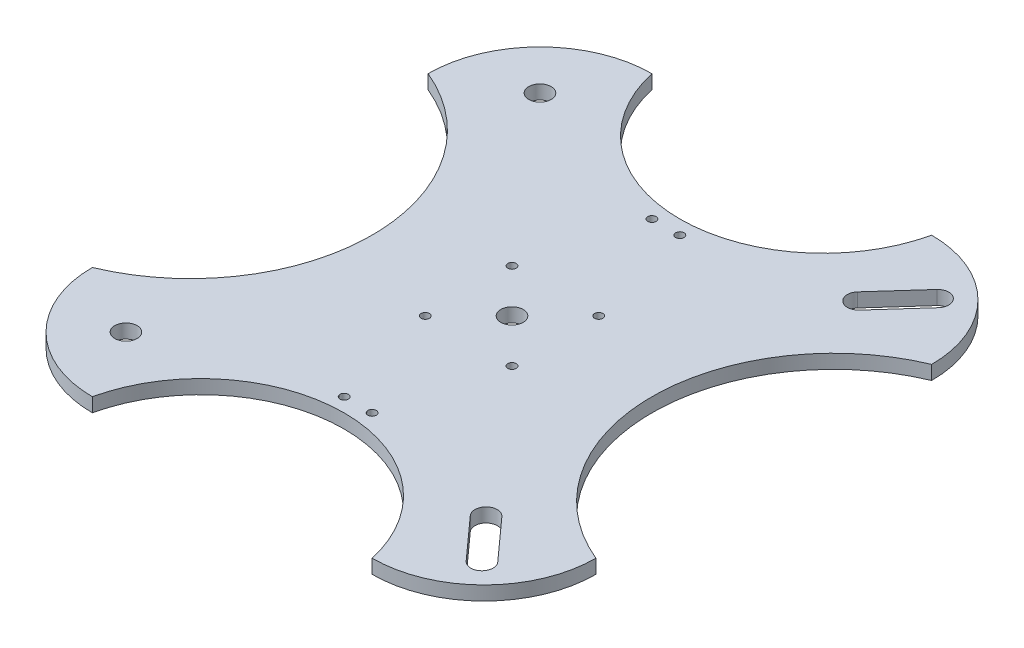
ISO-10303-21;
HEADER;
FILE_DESCRIPTION(('STEP AP214'),'2;1');
FILE_NAME('part.step','',(''),(''),'','','');
FILE_SCHEMA(('AUTOMOTIVE_DESIGN { 1 0 10303 214 1 1 1 1 }'));
ENDSEC;
DATA;
#1=APPLICATION_CONTEXT('core data for automotive mechanical design processes');
#2=APPLICATION_PROTOCOL_DEFINITION('international standard','automotive_design',2000,#1);
#3=PRODUCT_CONTEXT('',#1,'mechanical');
#4=PRODUCT('Part','Part','',(#3));
#5=PRODUCT_RELATED_PRODUCT_CATEGORY('part','',(#4));
#6=PRODUCT_DEFINITION_FORMATION('','',#4);
#7=PRODUCT_DEFINITION_CONTEXT('part definition',#1,'design');
#8=PRODUCT_DEFINITION('design','',#6,#7);
#9=PRODUCT_DEFINITION_SHAPE('','',#8);
#10=(LENGTH_UNIT() NAMED_UNIT(*) SI_UNIT(.MILLI.,.METRE.));
#11=(NAMED_UNIT(*) PLANE_ANGLE_UNIT() SI_UNIT($,.RADIAN.));
#12=(NAMED_UNIT(*) SI_UNIT($,.STERADIAN.) SOLID_ANGLE_UNIT());
#13=UNCERTAINTY_MEASURE_WITH_UNIT(LENGTH_MEASURE(1.E-05),#10,'distance_accuracy_value','');
#14=(GEOMETRIC_REPRESENTATION_CONTEXT(3) GLOBAL_UNCERTAINTY_ASSIGNED_CONTEXT((#13)) GLOBAL_UNIT_ASSIGNED_CONTEXT((#10,
#11,#12)) REPRESENTATION_CONTEXT('',''));
#15=CARTESIAN_POINT('',(0.,0.,0.));
#16=DIRECTION('',(0.,0.,1.));
#17=DIRECTION('',(1.,0.,0.));
#18=AXIS2_PLACEMENT_3D('',#15,#16,#17);
#19=CARTESIAN_POINT('',(-25.,5.,-85.625));
#20=DIRECTION('',(0.,-1.,0.));
#21=DIRECTION('',(0.,0.,-1.));
#22=AXIS2_PLACEMENT_3D('',#19,#20,#21);
#23=PLANE('',#22);
#24=CARTESIAN_POINT('',(5.,5.,55.));
#25=DIRECTION('',(0.,1.,0.));
#26=DIRECTION('',(0.,0.,1.));
#27=AXIS2_PLACEMENT_3D('',#24,#25,#26);
#28=CIRCLE('',#27,1.5);
#29=CARTESIAN_POINT('',(5.,5.,56.5));
#30=VERTEX_POINT('',#29);
#31=EDGE_CURVE('E526',#30,#30,#28,.T.);
#32=ORIENTED_EDGE('',*,*,#31,.F.);
#33=EDGE_LOOP('',(#32));
#34=FACE_BOUND('',#33,.T.);
#35=CARTESIAN_POINT('',(-5.,5.,55.));
#36=DIRECTION('',(0.,1.,0.));
#37=DIRECTION('',(0.,0.,1.));
#38=AXIS2_PLACEMENT_3D('',#35,#36,#37);
#39=CIRCLE('',#38,1.5);
#40=CARTESIAN_POINT('',(-5.,5.,56.5));
#41=VERTEX_POINT('',#40);
#42=EDGE_CURVE('E528',#41,#41,#39,.T.);
#43=ORIENTED_EDGE('',*,*,#42,.F.);
#44=EDGE_LOOP('',(#43));
#45=FACE_BOUND('',#44,.T.);
#46=CARTESIAN_POINT('',(5.,5.,-55.));
#47=DIRECTION('',(0.,1.,0.));
#48=DIRECTION('',(0.,0.,1.));
#49=AXIS2_PLACEMENT_3D('',#46,#47,#48);
#50=CIRCLE('',#49,1.5);
#51=CARTESIAN_POINT('',(5.,5.,-53.5));
#52=VERTEX_POINT('',#51);
#53=EDGE_CURVE('E534',#52,#52,#50,.T.);
#54=ORIENTED_EDGE('',*,*,#53,.F.);
#55=EDGE_LOOP('',(#54));
#56=FACE_BOUND('',#55,.T.);
#57=CARTESIAN_POINT('',(-5.,5.,-55.));
#58=DIRECTION('',(0.,1.,0.));
#59=DIRECTION('',(0.,0.,1.));
#60=AXIS2_PLACEMENT_3D('',#57,#58,#59);
#61=CIRCLE('',#60,1.5);
#62=CARTESIAN_POINT('',(-5.,5.,-53.5));
#63=VERTEX_POINT('',#62);
#64=EDGE_CURVE('E540',#63,#63,#61,.T.);
#65=ORIENTED_EDGE('',*,*,#64,.F.);
#66=EDGE_LOOP('',(#65));
#67=FACE_BOUND('',#66,.T.);
#68=CARTESIAN_POINT('',(-15.5,5.,15.5));
#69=DIRECTION('',(0.,1.,0.));
#70=DIRECTION('',(0.,0.,1.));
#71=AXIS2_PLACEMENT_3D('',#68,#69,#70);
#72=CIRCLE('',#71,1.5);
#73=CARTESIAN_POINT('',(-15.5,5.,17.));
#74=VERTEX_POINT('',#73);
#75=EDGE_CURVE('E546',#74,#74,#72,.T.);
#76=ORIENTED_EDGE('',*,*,#75,.F.);
#77=EDGE_LOOP('',(#76));
#78=FACE_BOUND('',#77,.T.);
#79=CARTESIAN_POINT('',(15.5,5.,15.5));
#80=DIRECTION('',(0.,1.,0.));
#81=DIRECTION('',(0.,0.,1.));
#82=AXIS2_PLACEMENT_3D('',#79,#80,#81);
#83=CIRCLE('',#82,1.5);
#84=CARTESIAN_POINT('',(15.5,5.,17.));
#85=VERTEX_POINT('',#84);
#86=EDGE_CURVE('E552',#85,#85,#83,.T.);
#87=ORIENTED_EDGE('',*,*,#86,.F.);
#88=EDGE_LOOP('',(#87));
#89=FACE_BOUND('',#88,.T.);
#90=CARTESIAN_POINT('',(15.5,5.,-15.5));
#91=DIRECTION('',(0.,1.,0.));
#92=DIRECTION('',(0.,0.,1.));
#93=AXIS2_PLACEMENT_3D('',#90,#91,#92);
#94=CIRCLE('',#93,1.5);
#95=CARTESIAN_POINT('',(15.5,5.,-14.));
#96=VERTEX_POINT('',#95);
#97=EDGE_CURVE('E558',#96,#96,#94,.T.);
#98=ORIENTED_EDGE('',*,*,#97,.F.);
#99=EDGE_LOOP('',(#98));
#100=FACE_BOUND('',#99,.T.);
#101=CARTESIAN_POINT('',(-15.5,5.,-15.5));
#102=DIRECTION('',(0.,1.,0.));
#103=DIRECTION('',(0.,0.,1.));
#104=AXIS2_PLACEMENT_3D('',#101,#102,#103);
#105=CIRCLE('',#104,1.5);
#106=CARTESIAN_POINT('',(-15.5,5.,-14.));
#107=VERTEX_POINT('',#106);
#108=EDGE_CURVE('E564',#107,#107,#105,.T.);
#109=ORIENTED_EDGE('',*,*,#108,.F.);
#110=EDGE_LOOP('',(#109));
#111=FACE_BOUND('',#110,.T.);
#112=CARTESIAN_POINT('',(70.6896473162245,5.,81.4329414624716));
#113=DIRECTION('',(0.,1.,0.));
#114=DIRECTION('',(0.,0.,-1.));
#115=AXIS2_PLACEMENT_3D('',#112,#113,#114);
#116=CIRCLE('',#115,3.99999999999999);
#117=CARTESIAN_POINT('',(67.7164707312358,5.,84.1088003889613));
#118=VERTEX_POINT('',#117);
#119=CARTESIAN_POINT('',(73.6628239012131,5.,78.7570825359817));
#120=VERTEX_POINT('',#119);
#121=EDGE_CURVE('E184',#118,#120,#116,.T.);
#122=ORIENTED_EDGE('',*,*,#121,.F.);
#123=DIRECTION('',(0.668964731622449,0.,0.743294146247166));
#124=VECTOR('',#123,1.);
#125=CARTESIAN_POINT('',(67.7164707312358,5.,84.1088003889613));
#126=LINE('',#125,#124);
#127=CARTESIAN_POINT('',(54.3371760987868,5.,69.242917464018));
#128=VERTEX_POINT('',#127);
#129=EDGE_CURVE('E192',#128,#118,#126,.T.);
#130=ORIENTED_EDGE('',*,*,#129,.F.);
#131=CARTESIAN_POINT('',(57.3103526837755,5.,66.5670585375282));
#132=DIRECTION('',(0.,1.,0.));
#133=DIRECTION('',(0.,0.,1.));
#134=AXIS2_PLACEMENT_3D('',#131,#132,#133);
#135=CIRCLE('',#134,3.99999999999998);
#136=CARTESIAN_POINT('',(60.2835292687642,5.,63.8911996110384));
#137=VERTEX_POINT('',#136);
#138=EDGE_CURVE('E189',#137,#128,#135,.T.);
#139=ORIENTED_EDGE('',*,*,#138,.F.);
#140=DIRECTION('',(-0.66896473162245,0.,-0.743294146247166));
#141=VECTOR('',#140,1.);
#142=CARTESIAN_POINT('',(73.6628239012131,5.,78.7570825359817));
#143=LINE('',#142,#141);
#144=EDGE_CURVE('E186',#120,#137,#143,.T.);
#145=ORIENTED_EDGE('',*,*,#144,.F.);
#146=EDGE_LOOP('',(#122,#130,#139,#145));
#147=FACE_BOUND('',#146,.T.);
#148=CARTESIAN_POINT('',(-63.9999999999999,5.,73.9999999999999));
#149=DIRECTION('',(0.,1.,0.));
#150=DIRECTION('',(0.,0.,1.));
#151=AXIS2_PLACEMENT_3D('',#148,#149,#150);
#152=CIRCLE('',#151,4.00000000000001);
#153=CARTESIAN_POINT('',(-63.9999999999999,5.,77.9999999999999));
#154=VERTEX_POINT('',#153);
#155=EDGE_CURVE('E221',#154,#154,#152,.T.);
#156=ORIENTED_EDGE('',*,*,#155,.F.);
#157=EDGE_LOOP('',(#156));
#158=FACE_BOUND('',#157,.T.);
#159=CARTESIAN_POINT('',(0.,5.,-111.25));
#160=DIRECTION('',(0.,-1.,0.));
#161=DIRECTION('',(0.,0.,-1.));
#162=AXIS2_PLACEMENT_3D('',#159,#160,#161);
#163=CIRCLE('',#162,51.25);
#164=CARTESIAN_POINT('',(50.,5.,-100.));
#165=VERTEX_POINT('',#164);
#166=CARTESIAN_POINT('',(-50.,5.,-100.));
#167=VERTEX_POINT('',#166);
#168=EDGE_CURVE('E233',#165,#167,#163,.T.);
#169=ORIENTED_EDGE('',*,*,#168,.T.);
#170=CARTESIAN_POINT('',(-50.,5.,-59.9999999999999));
#171=DIRECTION('',(0.,1.,0.));
#172=DIRECTION('',(0.,0.,1.));
#173=AXIS2_PLACEMENT_3D('',#170,#171,#172);
#174=CIRCLE('',#173,40.0000000000001);
#175=CARTESIAN_POINT('',(-90.,5.,-60.));
#176=VERTEX_POINT('',#175);
#177=EDGE_CURVE('E236',#167,#176,#174,.T.);
#178=ORIENTED_EDGE('',*,*,#177,.T.);
#179=CARTESIAN_POINT('',(-115.,5.,0.));
#180=DIRECTION('',(0.,-1.,0.));
#181=DIRECTION('',(0.,0.,-1.));
#182=AXIS2_PLACEMENT_3D('',#179,#180,#181);
#183=CIRCLE('',#182,64.9999999999998);
#184=CARTESIAN_POINT('',(-90.,5.,59.9999999999999));
#185=VERTEX_POINT('',#184);
#186=EDGE_CURVE('E239',#176,#185,#183,.T.);
#187=ORIENTED_EDGE('',*,*,#186,.T.);
#188=CARTESIAN_POINT('',(-49.9999999999999,5.,59.9999999999999));
#189=DIRECTION('',(0.,1.,0.));
#190=DIRECTION('',(0.,0.,-1.));
#191=AXIS2_PLACEMENT_3D('',#188,#189,#190);
#192=CIRCLE('',#191,40.0000000000001);
#193=CARTESIAN_POINT('',(-49.9999999999999,5.,100.));
#194=VERTEX_POINT('',#193);
#195=EDGE_CURVE('E241',#185,#194,#192,.T.);
#196=ORIENTED_EDGE('',*,*,#195,.T.);
#197=CARTESIAN_POINT('',(0.,5.,111.25));
#198=DIRECTION('',(0.,-1.,0.));
#199=DIRECTION('',(0.,0.,1.));
#200=AXIS2_PLACEMENT_3D('',#197,#198,#199);
#201=CIRCLE('',#200,51.2499999999999);
#202=CARTESIAN_POINT('',(49.9999999999999,5.,100.));
#203=VERTEX_POINT('',#202);
#204=EDGE_CURVE('E243',#194,#203,#201,.T.);
#205=ORIENTED_EDGE('',*,*,#204,.T.);
#206=CARTESIAN_POINT('',(49.9999999999999,5.,59.9999999999999));
#207=DIRECTION('',(0.,1.,0.));
#208=DIRECTION('',(0.,0.,-1.));
#209=AXIS2_PLACEMENT_3D('',#206,#207,#208);
#210=CIRCLE('',#209,40.0000000000001);
#211=CARTESIAN_POINT('',(90.,5.,60.));
#212=VERTEX_POINT('',#211);
#213=EDGE_CURVE('E245',#203,#212,#210,.T.);
#214=ORIENTED_EDGE('',*,*,#213,.T.);
#215=CARTESIAN_POINT('',(115.,5.,0.));
#216=DIRECTION('',(0.,-1.,0.));
#217=DIRECTION('',(0.,0.,1.));
#218=AXIS2_PLACEMENT_3D('',#215,#216,#217);
#219=CIRCLE('',#218,65.);
#220=CARTESIAN_POINT('',(90.,5.,-60.));
#221=VERTEX_POINT('',#220);
#222=EDGE_CURVE('E247',#212,#221,#219,.T.);
#223=ORIENTED_EDGE('',*,*,#222,.T.);
#224=CARTESIAN_POINT('',(50.,5.,-60.));
#225=DIRECTION('',(0.,1.,0.));
#226=DIRECTION('',(0.,0.,-1.));
#227=AXIS2_PLACEMENT_3D('',#224,#225,#226);
#228=CIRCLE('',#227,40.);
#229=EDGE_CURVE('E249',#221,#165,#228,.T.);
#230=ORIENTED_EDGE('',*,*,#229,.T.);
#231=EDGE_LOOP('',(#169,#178,#187,#196,#205,#214,#223,#230));
#232=FACE_BOUND('',#231,.T.);
#233=CARTESIAN_POINT('',(-63.9999999999999,5.,-74.));
#234=DIRECTION('',(0.,1.,0.));
#235=DIRECTION('',(0.,0.,1.));
#236=AXIS2_PLACEMENT_3D('',#233,#234,#235);
#237=CIRCLE('',#236,4.00000000000001);
#238=CARTESIAN_POINT('',(-63.9999999999999,5.,-70.));
#239=VERTEX_POINT('',#238);
#240=EDGE_CURVE('E227',#239,#239,#237,.T.);
#241=ORIENTED_EDGE('',*,*,#240,.F.);
#242=EDGE_LOOP('',(#241));
#243=FACE_BOUND('',#242,.T.);
#244=CARTESIAN_POINT('',(0.,5.,0.));
#245=DIRECTION('',(0.,1.,0.));
#246=DIRECTION('',(0.,0.,1.));
#247=AXIS2_PLACEMENT_3D('',#244,#245,#246);
#248=CIRCLE('',#247,4.00000000000001);
#249=CARTESIAN_POINT('',(0.,5.,4.00000000000001));
#250=VERTEX_POINT('',#249);
#251=EDGE_CURVE('E215',#250,#250,#248,.T.);
#252=ORIENTED_EDGE('',*,*,#251,.F.);
#253=EDGE_LOOP('',(#252));
#254=FACE_BOUND('',#253,.T.);
#255=CARTESIAN_POINT('',(57.3103526837754,5.,-66.5670585375283));
#256=DIRECTION('',(0.,1.,0.));
#257=DIRECTION('',(0.,0.,-1.));
#258=AXIS2_PLACEMENT_3D('',#255,#256,#257);
#259=CIRCLE('',#258,4.00000000000001);
#260=CARTESIAN_POINT('',(54.3371760987867,5.,-69.2429174640181));
#261=VERTEX_POINT('',#260);
#262=CARTESIAN_POINT('',(60.2835292687641,5.,-63.8911996110385));
#263=VERTEX_POINT('',#262);
#264=EDGE_CURVE('E146',#261,#263,#259,.T.);
#265=ORIENTED_EDGE('',*,*,#264,.F.);
#266=DIRECTION('',(-0.66896473162245,0.,0.743294146247166));
#267=VECTOR('',#266,1.);
#268=CARTESIAN_POINT('',(54.3371760987867,5.,-69.2429174640181));
#269=LINE('',#268,#267);
#270=CARTESIAN_POINT('',(67.7164707312358,5.,-84.1088003889614));
#271=VERTEX_POINT('',#270);
#272=EDGE_CURVE('E168',#271,#261,#269,.T.);
#273=ORIENTED_EDGE('',*,*,#272,.F.);
#274=CARTESIAN_POINT('',(70.6896473162244,5.,-81.4329414624716));
#275=DIRECTION('',(0.,1.,0.));
#276=DIRECTION('',(0.,0.,1.));
#277=AXIS2_PLACEMENT_3D('',#274,#275,#276);
#278=CIRCLE('',#277,4.00000000000001);
#279=CARTESIAN_POINT('',(73.6628239012131,5.,-78.7570825359818));
#280=VERTEX_POINT('',#279);
#281=EDGE_CURVE('E166',#280,#271,#278,.T.);
#282=ORIENTED_EDGE('',*,*,#281,.F.);
#283=DIRECTION('',(0.66896473162245,0.,-0.743294146247166));
#284=VECTOR('',#283,1.);
#285=CARTESIAN_POINT('',(60.2835292687641,5.,-63.8911996110385));
#286=LINE('',#285,#284);
#287=EDGE_CURVE('E154',#263,#280,#286,.T.);
#288=ORIENTED_EDGE('',*,*,#287,.F.);
#289=EDGE_LOOP('',(#265,#273,#282,#288));
#290=FACE_BOUND('',#289,.T.);
#291=ADVANCED_FACE('F33',(#34,#45,#56,#67,#78,#89,#100,#111,#147,#158,#232,#243,#254,#290),#23,.F.);
#292=CARTESIAN_POINT('',(-25.,0.,-85.625));
#293=DIRECTION('',(0.,-1.,0.));
#294=DIRECTION('',(0.,0.,-1.));
#295=AXIS2_PLACEMENT_3D('',#292,#293,#294);
#296=PLANE('',#295);
#297=CARTESIAN_POINT('',(5.,0.,55.));
#298=DIRECTION('',(0.,1.,0.));
#299=DIRECTION('',(0.,0.,1.));
#300=AXIS2_PLACEMENT_3D('',#297,#298,#299);
#301=CIRCLE('',#300,1.5);
#302=CARTESIAN_POINT('',(5.,0.,56.5));
#303=VERTEX_POINT('',#302);
#304=EDGE_CURVE('E524',#303,#303,#301,.T.);
#305=ORIENTED_EDGE('',*,*,#304,.T.);
#306=EDGE_LOOP('',(#305));
#307=FACE_BOUND('',#306,.T.);
#308=CARTESIAN_POINT('',(-5.,0.,55.));
#309=DIRECTION('',(0.,1.,0.));
#310=DIRECTION('',(0.,0.,1.));
#311=AXIS2_PLACEMENT_3D('',#308,#309,#310);
#312=CIRCLE('',#311,1.5);
#313=CARTESIAN_POINT('',(-5.,0.,56.5));
#314=VERTEX_POINT('',#313);
#315=EDGE_CURVE('E531',#314,#314,#312,.T.);
#316=ORIENTED_EDGE('',*,*,#315,.T.);
#317=EDGE_LOOP('',(#316));
#318=FACE_BOUND('',#317,.T.);
#319=CARTESIAN_POINT('',(5.,0.,-55.));
#320=DIRECTION('',(0.,1.,0.));
#321=DIRECTION('',(0.,0.,1.));
#322=AXIS2_PLACEMENT_3D('',#319,#320,#321);
#323=CIRCLE('',#322,1.5);
#324=CARTESIAN_POINT('',(5.,0.,-53.5));
#325=VERTEX_POINT('',#324);
#326=EDGE_CURVE('E537',#325,#325,#323,.T.);
#327=ORIENTED_EDGE('',*,*,#326,.T.);
#328=EDGE_LOOP('',(#327));
#329=FACE_BOUND('',#328,.T.);
#330=CARTESIAN_POINT('',(-5.,0.,-55.));
#331=DIRECTION('',(0.,1.,0.));
#332=DIRECTION('',(0.,0.,1.));
#333=AXIS2_PLACEMENT_3D('',#330,#331,#332);
#334=CIRCLE('',#333,1.5);
#335=CARTESIAN_POINT('',(-5.,0.,-53.5));
#336=VERTEX_POINT('',#335);
#337=EDGE_CURVE('E543',#336,#336,#334,.T.);
#338=ORIENTED_EDGE('',*,*,#337,.T.);
#339=EDGE_LOOP('',(#338));
#340=FACE_BOUND('',#339,.T.);
#341=CARTESIAN_POINT('',(-15.5,0.,15.5));
#342=DIRECTION('',(0.,1.,0.));
#343=DIRECTION('',(0.,0.,1.));
#344=AXIS2_PLACEMENT_3D('',#341,#342,#343);
#345=CIRCLE('',#344,1.5);
#346=CARTESIAN_POINT('',(-15.5,0.,17.));
#347=VERTEX_POINT('',#346);
#348=EDGE_CURVE('E549',#347,#347,#345,.T.);
#349=ORIENTED_EDGE('',*,*,#348,.T.);
#350=EDGE_LOOP('',(#349));
#351=FACE_BOUND('',#350,.T.);
#352=CARTESIAN_POINT('',(15.5,0.,15.5));
#353=DIRECTION('',(0.,1.,0.));
#354=DIRECTION('',(0.,0.,1.));
#355=AXIS2_PLACEMENT_3D('',#352,#353,#354);
#356=CIRCLE('',#355,1.5);
#357=CARTESIAN_POINT('',(15.5,0.,17.));
#358=VERTEX_POINT('',#357);
#359=EDGE_CURVE('E555',#358,#358,#356,.T.);
#360=ORIENTED_EDGE('',*,*,#359,.T.);
#361=EDGE_LOOP('',(#360));
#362=FACE_BOUND('',#361,.T.);
#363=CARTESIAN_POINT('',(15.5,0.,-15.5));
#364=DIRECTION('',(0.,1.,0.));
#365=DIRECTION('',(0.,0.,1.));
#366=AXIS2_PLACEMENT_3D('',#363,#364,#365);
#367=CIRCLE('',#366,1.5);
#368=CARTESIAN_POINT('',(15.5,0.,-14.));
#369=VERTEX_POINT('',#368);
#370=EDGE_CURVE('E561',#369,#369,#367,.T.);
#371=ORIENTED_EDGE('',*,*,#370,.T.);
#372=EDGE_LOOP('',(#371));
#373=FACE_BOUND('',#372,.T.);
#374=CARTESIAN_POINT('',(-15.5,0.,-15.5));
#375=DIRECTION('',(0.,1.,0.));
#376=DIRECTION('',(0.,0.,1.));
#377=AXIS2_PLACEMENT_3D('',#374,#375,#376);
#378=CIRCLE('',#377,1.5);
#379=CARTESIAN_POINT('',(-15.5,0.,-14.));
#380=VERTEX_POINT('',#379);
#381=EDGE_CURVE('E174',#380,#380,#378,.T.);
#382=ORIENTED_EDGE('',*,*,#381,.T.);
#383=EDGE_LOOP('',(#382));
#384=FACE_BOUND('',#383,.T.);
#385=DIRECTION('',(0.668964731622449,0.,0.743294146247166));
#386=VECTOR('',#385,1.);
#387=CARTESIAN_POINT('',(67.7164707312358,0.,84.1088003889613));
#388=LINE('',#387,#386);
#389=CARTESIAN_POINT('',(54.3371760987868,0.,69.242917464018));
#390=VERTEX_POINT('',#389);
#391=CARTESIAN_POINT('',(67.7164707312358,0.,84.1088003889613));
#392=VERTEX_POINT('',#391);
#393=EDGE_CURVE('E187',#390,#392,#388,.T.);
#394=ORIENTED_EDGE('',*,*,#393,.T.);
#395=CARTESIAN_POINT('',(70.6896473162245,0.,81.4329414624716));
#396=DIRECTION('',(0.,1.,0.));
#397=DIRECTION('',(0.,0.,-1.));
#398=AXIS2_PLACEMENT_3D('',#395,#396,#397);
#399=CIRCLE('',#398,3.99999999999999);
#400=CARTESIAN_POINT('',(73.6628239012131,0.,78.7570825359817));
#401=VERTEX_POINT('',#400);
#402=EDGE_CURVE('E162',#392,#401,#399,.T.);
#403=ORIENTED_EDGE('',*,*,#402,.T.);
#404=DIRECTION('',(-0.66896473162245,0.,-0.743294146247166));
#405=VECTOR('',#404,1.);
#406=CARTESIAN_POINT('',(73.6628239012131,0.,78.7570825359817));
#407=LINE('',#406,#405);
#408=CARTESIAN_POINT('',(60.2835292687642,0.,63.8911996110384));
#409=VERTEX_POINT('',#408);
#410=EDGE_CURVE('E197',#401,#409,#407,.T.);
#411=ORIENTED_EDGE('',*,*,#410,.T.);
#412=CARTESIAN_POINT('',(57.3103526837755,0.,66.5670585375282));
#413=DIRECTION('',(0.,1.,0.));
#414=DIRECTION('',(0.,0.,1.));
#415=AXIS2_PLACEMENT_3D('',#412,#413,#414);
#416=CIRCLE('',#415,3.99999999999998);
#417=EDGE_CURVE('E200',#409,#390,#416,.T.);
#418=ORIENTED_EDGE('',*,*,#417,.T.);
#419=EDGE_LOOP('',(#394,#403,#411,#418));
#420=FACE_BOUND('',#419,.T.);
#421=CARTESIAN_POINT('',(-63.9999999999999,0.,73.9999999999999));
#422=DIRECTION('',(0.,1.,0.));
#423=DIRECTION('',(0.,0.,1.));
#424=AXIS2_PLACEMENT_3D('',#421,#422,#423);
#425=CIRCLE('',#424,4.00000000000001);
#426=CARTESIAN_POINT('',(-63.9999999999999,0.,77.9999999999999));
#427=VERTEX_POINT('',#426);
#428=EDGE_CURVE('E218',#427,#427,#425,.T.);
#429=ORIENTED_EDGE('',*,*,#428,.T.);
#430=EDGE_LOOP('',(#429));
#431=FACE_BOUND('',#430,.T.);
#432=CARTESIAN_POINT('',(0.,0.,-111.25));
#433=DIRECTION('',(0.,-1.,0.));
#434=DIRECTION('',(0.,0.,-1.));
#435=AXIS2_PLACEMENT_3D('',#432,#433,#434);
#436=CIRCLE('',#435,51.25);
#437=CARTESIAN_POINT('',(50.,0.,-100.));
#438=VERTEX_POINT('',#437);
#439=CARTESIAN_POINT('',(-50.,0.,-100.));
#440=VERTEX_POINT('',#439);
#441=EDGE_CURVE('E230',#438,#440,#436,.T.);
#442=ORIENTED_EDGE('',*,*,#441,.F.);
#443=CARTESIAN_POINT('',(50.,0.,-60.));
#444=DIRECTION('',(0.,1.,0.));
#445=DIRECTION('',(0.,0.,-1.));
#446=AXIS2_PLACEMENT_3D('',#443,#444,#445);
#447=CIRCLE('',#446,40.);
#448=CARTESIAN_POINT('',(90.,0.,-60.));
#449=VERTEX_POINT('',#448);
#450=EDGE_CURVE('E237',#449,#438,#447,.T.);
#451=ORIENTED_EDGE('',*,*,#450,.F.);
#452=CARTESIAN_POINT('',(115.,0.,0.));
#453=DIRECTION('',(0.,-1.,0.));
#454=DIRECTION('',(0.,0.,1.));
#455=AXIS2_PLACEMENT_3D('',#452,#453,#454);
#456=CIRCLE('',#455,65.);
#457=CARTESIAN_POINT('',(90.,0.,60.));
#458=VERTEX_POINT('',#457);
#459=EDGE_CURVE('E264',#458,#449,#456,.T.);
#460=ORIENTED_EDGE('',*,*,#459,.F.);
#461=CARTESIAN_POINT('',(49.9999999999999,0.,59.9999999999999));
#462=DIRECTION('',(0.,1.,0.));
#463=DIRECTION('',(0.,0.,-1.));
#464=AXIS2_PLACEMENT_3D('',#461,#462,#463);
#465=CIRCLE('',#464,40.0000000000001);
#466=CARTESIAN_POINT('',(49.9999999999999,0.,100.));
#467=VERTEX_POINT('',#466);
#468=EDGE_CURVE('E262',#467,#458,#465,.T.);
#469=ORIENTED_EDGE('',*,*,#468,.F.);
#470=CARTESIAN_POINT('',(0.,0.,111.25));
#471=DIRECTION('',(0.,-1.,0.));
#472=DIRECTION('',(0.,0.,1.));
#473=AXIS2_PLACEMENT_3D('',#470,#471,#472);
#474=CIRCLE('',#473,51.2499999999999);
#475=CARTESIAN_POINT('',(-49.9999999999999,0.,100.));
#476=VERTEX_POINT('',#475);
#477=EDGE_CURVE('E260',#476,#467,#474,.T.);
#478=ORIENTED_EDGE('',*,*,#477,.F.);
#479=CARTESIAN_POINT('',(-49.9999999999999,0.,59.9999999999999));
#480=DIRECTION('',(0.,1.,0.));
#481=DIRECTION('',(0.,0.,-1.));
#482=AXIS2_PLACEMENT_3D('',#479,#480,#481);
#483=CIRCLE('',#482,40.0000000000001);
#484=CARTESIAN_POINT('',(-90.,0.,59.9999999999999));
#485=VERTEX_POINT('',#484);
#486=EDGE_CURVE('E258',#485,#476,#483,.T.);
#487=ORIENTED_EDGE('',*,*,#486,.F.);
#488=CARTESIAN_POINT('',(-115.,0.,0.));
#489=DIRECTION('',(0.,-1.,0.));
#490=DIRECTION('',(0.,0.,-1.));
#491=AXIS2_PLACEMENT_3D('',#488,#489,#490);
#492=CIRCLE('',#491,64.9999999999998);
#493=CARTESIAN_POINT('',(-90.,0.,-60.));
#494=VERTEX_POINT('',#493);
#495=EDGE_CURVE('E256',#494,#485,#492,.T.);
#496=ORIENTED_EDGE('',*,*,#495,.F.);
#497=CARTESIAN_POINT('',(-50.,0.,-59.9999999999999));
#498=DIRECTION('',(0.,1.,0.));
#499=DIRECTION('',(0.,0.,1.));
#500=AXIS2_PLACEMENT_3D('',#497,#498,#499);
#501=CIRCLE('',#500,40.0000000000001);
#502=EDGE_CURVE('E254',#440,#494,#501,.T.);
#503=ORIENTED_EDGE('',*,*,#502,.F.);
#504=EDGE_LOOP('',(#442,#451,#460,#469,#478,#487,#496,#503));
#505=FACE_BOUND('',#504,.T.);
#506=CARTESIAN_POINT('',(-63.9999999999999,0.,-74.));
#507=DIRECTION('',(0.,1.,0.));
#508=DIRECTION('',(0.,0.,1.));
#509=AXIS2_PLACEMENT_3D('',#506,#507,#508);
#510=CIRCLE('',#509,4.00000000000001);
#511=CARTESIAN_POINT('',(-63.9999999999999,0.,-70.));
#512=VERTEX_POINT('',#511);
#513=EDGE_CURVE('E224',#512,#512,#510,.T.);
#514=ORIENTED_EDGE('',*,*,#513,.T.);
#515=EDGE_LOOP('',(#514));
#516=FACE_BOUND('',#515,.T.);
#517=CARTESIAN_POINT('',(0.,0.,0.));
#518=DIRECTION('',(0.,1.,0.));
#519=DIRECTION('',(0.,0.,1.));
#520=AXIS2_PLACEMENT_3D('',#517,#518,#519);
#521=CIRCLE('',#520,4.00000000000001);
#522=CARTESIAN_POINT('',(0.,0.,4.00000000000001));
#523=VERTEX_POINT('',#522);
#524=EDGE_CURVE('E214',#523,#523,#521,.T.);
#525=ORIENTED_EDGE('',*,*,#524,.T.);
#526=EDGE_LOOP('',(#525));
#527=FACE_BOUND('',#526,.T.);
#528=DIRECTION('',(-0.66896473162245,0.,0.743294146247166));
#529=VECTOR('',#528,1.);
#530=CARTESIAN_POINT('',(54.3371760987867,0.,-69.2429174640181));
#531=LINE('',#530,#529);
#532=CARTESIAN_POINT('',(67.7164707312357,0.,-84.1088003889614));
#533=VERTEX_POINT('',#532);
#534=CARTESIAN_POINT('',(54.3371760987867,0.,-69.2429174640181));
#535=VERTEX_POINT('',#534);
#536=EDGE_CURVE('E155',#533,#535,#531,.T.);
#537=ORIENTED_EDGE('',*,*,#536,.T.);
#538=CARTESIAN_POINT('',(57.3103526837754,0.,-66.5670585375283));
#539=DIRECTION('',(0.,1.,0.));
#540=DIRECTION('',(0.,0.,-1.));
#541=AXIS2_PLACEMENT_3D('',#538,#539,#540);
#542=CIRCLE('',#541,4.00000000000001);
#543=CARTESIAN_POINT('',(60.2835292687641,0.,-63.8911996110385));
#544=VERTEX_POINT('',#543);
#545=EDGE_CURVE('E56',#535,#544,#542,.T.);
#546=ORIENTED_EDGE('',*,*,#545,.T.);
#547=DIRECTION('',(0.66896473162245,0.,-0.743294146247166));
#548=VECTOR('',#547,1.);
#549=CARTESIAN_POINT('',(60.2835292687641,0.,-63.8911996110385));
#550=LINE('',#549,#548);
#551=CARTESIAN_POINT('',(73.6628239012131,0.,-78.7570825359818));
#552=VERTEX_POINT('',#551);
#553=EDGE_CURVE('E161',#544,#552,#550,.T.);
#554=ORIENTED_EDGE('',*,*,#553,.T.);
#555=CARTESIAN_POINT('',(70.6896473162244,0.,-81.4329414624716));
#556=DIRECTION('',(0.,1.,0.));
#557=DIRECTION('',(0.,0.,1.));
#558=AXIS2_PLACEMENT_3D('',#555,#556,#557);
#559=CIRCLE('',#558,4.00000000000001);
#560=EDGE_CURVE('E176',#552,#533,#559,.T.);
#561=ORIENTED_EDGE('',*,*,#560,.T.);
#562=EDGE_LOOP('',(#537,#546,#554,#561));
#563=FACE_BOUND('',#562,.T.);
#564=ADVANCED_FACE('F294',(#307,#318,#329,#340,#351,#362,#373,#384,#420,#431,#505,#516,#527,
#563),#296,.T.);
#565=CARTESIAN_POINT('',(0.,5.,-111.25));
#566=DIRECTION('',(0.,-1.,0.));
#567=DIRECTION('',(0.,0.,-1.));
#568=AXIS2_PLACEMENT_3D('',#565,#566,#567);
#569=CYLINDRICAL_SURFACE('',#568,51.25);
#570=ORIENTED_EDGE('',*,*,#441,.T.);
#571=DIRECTION('',(0.,-1.,0.));
#572=VECTOR('',#571,1.);
#573=CARTESIAN_POINT('',(-50.,5.,-100.));
#574=LINE('',#573,#572);
#575=EDGE_CURVE('E11',#167,#440,#574,.T.);
#576=ORIENTED_EDGE('',*,*,#575,.F.);
#577=ORIENTED_EDGE('',*,*,#168,.F.);
#578=DIRECTION('',(0.,-1.,0.));
#579=VECTOR('',#578,1.);
#580=CARTESIAN_POINT('',(50.,5.,-100.));
#581=LINE('',#580,#579);
#582=EDGE_CURVE('E251',#165,#438,#581,.T.);
#583=ORIENTED_EDGE('',*,*,#582,.T.);
#584=EDGE_LOOP('',(#570,#576,#577,#583));
#585=FACE_BOUND('',#584,.T.);
#586=ADVANCED_FACE('F35',(#585),#569,.F.);
#587=CARTESIAN_POINT('',(-50.,5.,-59.9999999999999));
#588=DIRECTION('',(0.,-1.,0.));
#589=DIRECTION('',(0.,0.,-1.));
#590=AXIS2_PLACEMENT_3D('',#587,#588,#589);
#591=CYLINDRICAL_SURFACE('',#590,40.0000000000001);
#592=ORIENTED_EDGE('',*,*,#502,.T.);
#593=DIRECTION('',(0.,-1.,0.));
#594=VECTOR('',#593,1.);
#595=CARTESIAN_POINT('',(-90.,5.,-60.));
#596=LINE('',#595,#594);
#597=EDGE_CURVE('E41',#176,#494,#596,.T.);
#598=ORIENTED_EDGE('',*,*,#597,.F.);
#599=ORIENTED_EDGE('',*,*,#177,.F.);
#600=ORIENTED_EDGE('',*,*,#575,.T.);
#601=EDGE_LOOP('',(#592,#598,#599,#600));
#602=FACE_BOUND('',#601,.T.);
#603=ADVANCED_FACE('F312',(#602),#591,.T.);
#604=CARTESIAN_POINT('',(-115.,5.,0.));
#605=DIRECTION('',(0.,-1.,0.));
#606=DIRECTION('',(0.,0.,-1.));
#607=AXIS2_PLACEMENT_3D('',#604,#605,#606);
#608=CYLINDRICAL_SURFACE('',#607,64.9999999999998);
#609=ORIENTED_EDGE('',*,*,#495,.T.);
#610=DIRECTION('',(0.,-1.,0.));
#611=VECTOR('',#610,1.);
#612=CARTESIAN_POINT('',(-90.,5.,59.9999999999999));
#613=LINE('',#612,#611);
#614=EDGE_CURVE('E281',#185,#485,#613,.T.);
#615=ORIENTED_EDGE('',*,*,#614,.F.);
#616=ORIENTED_EDGE('',*,*,#186,.F.);
#617=ORIENTED_EDGE('',*,*,#597,.T.);
#618=EDGE_LOOP('',(#609,#615,#616,#617));
#619=FACE_BOUND('',#618,.T.);
#620=ADVANCED_FACE('F288',(#619),#608,.F.);
#621=CARTESIAN_POINT('',(-49.9999999999999,5.,59.9999999999999));
#622=DIRECTION('',(0.,-1.,0.));
#623=DIRECTION('',(0.,0.,-1.));
#624=AXIS2_PLACEMENT_3D('',#621,#622,#623);
#625=CYLINDRICAL_SURFACE('',#624,40.0000000000001);
#626=ORIENTED_EDGE('',*,*,#486,.T.);
#627=DIRECTION('',(0.,-1.,0.));
#628=VECTOR('',#627,1.);
#629=CARTESIAN_POINT('',(-49.9999999999999,5.,100.));
#630=LINE('',#629,#628);
#631=EDGE_CURVE('E278',#194,#476,#630,.T.);
#632=ORIENTED_EDGE('',*,*,#631,.F.);
#633=ORIENTED_EDGE('',*,*,#195,.F.);
#634=ORIENTED_EDGE('',*,*,#614,.T.);
#635=EDGE_LOOP('',(#626,#632,#633,#634));
#636=FACE_BOUND('',#635,.T.);
#637=ADVANCED_FACE('F300',(#636),#625,.T.);
#638=CARTESIAN_POINT('',(0.,5.,111.25));
#639=DIRECTION('',(0.,-1.,0.));
#640=DIRECTION('',(0.,0.,-1.));
#641=AXIS2_PLACEMENT_3D('',#638,#639,#640);
#642=CYLINDRICAL_SURFACE('',#641,51.2499999999999);
#643=ORIENTED_EDGE('',*,*,#477,.T.);
#644=DIRECTION('',(0.,-1.,0.));
#645=VECTOR('',#644,1.);
#646=CARTESIAN_POINT('',(49.9999999999999,5.,100.));
#647=LINE('',#646,#645);
#648=EDGE_CURVE('E275',#203,#467,#647,.T.);
#649=ORIENTED_EDGE('',*,*,#648,.F.);
#650=ORIENTED_EDGE('',*,*,#204,.F.);
#651=ORIENTED_EDGE('',*,*,#631,.T.);
#652=EDGE_LOOP('',(#643,#649,#650,#651));
#653=FACE_BOUND('',#652,.T.);
#654=ADVANCED_FACE('F304',(#653),#642,.F.);
#655=CARTESIAN_POINT('',(49.9999999999999,5.,59.9999999999999));
#656=DIRECTION('',(0.,-1.,0.));
#657=DIRECTION('',(0.,0.,-1.));
#658=AXIS2_PLACEMENT_3D('',#655,#656,#657);
#659=CYLINDRICAL_SURFACE('',#658,40.0000000000001);
#660=ORIENTED_EDGE('',*,*,#468,.T.);
#661=DIRECTION('',(0.,-1.,0.));
#662=VECTOR('',#661,1.);
#663=CARTESIAN_POINT('',(90.,5.,60.));
#664=LINE('',#663,#662);
#665=EDGE_CURVE('E272',#212,#458,#664,.T.);
#666=ORIENTED_EDGE('',*,*,#665,.F.);
#667=ORIENTED_EDGE('',*,*,#213,.F.);
#668=ORIENTED_EDGE('',*,*,#648,.T.);
#669=EDGE_LOOP('',(#660,#666,#667,#668));
#670=FACE_BOUND('',#669,.T.);
#671=ADVANCED_FACE('F325',(#670),#659,.T.);
#672=CARTESIAN_POINT('',(115.,5.,0.));
#673=DIRECTION('',(0.,-1.,0.));
#674=DIRECTION('',(0.,0.,-1.));
#675=AXIS2_PLACEMENT_3D('',#672,#673,#674);
#676=CYLINDRICAL_SURFACE('',#675,65.);
#677=ORIENTED_EDGE('',*,*,#459,.T.);
#678=DIRECTION('',(0.,-1.,0.));
#679=VECTOR('',#678,1.);
#680=CARTESIAN_POINT('',(90.,5.,-60.));
#681=LINE('',#680,#679);
#682=EDGE_CURVE('E269',#221,#449,#681,.T.);
#683=ORIENTED_EDGE('',*,*,#682,.F.);
#684=ORIENTED_EDGE('',*,*,#222,.F.);
#685=ORIENTED_EDGE('',*,*,#665,.T.);
#686=EDGE_LOOP('',(#677,#683,#684,#685));
#687=FACE_BOUND('',#686,.T.);
#688=ADVANCED_FACE('F323',(#687),#676,.F.);
#689=CARTESIAN_POINT('',(50.,5.,-60.));
#690=DIRECTION('',(0.,-1.,0.));
#691=DIRECTION('',(0.,0.,-1.));
#692=AXIS2_PLACEMENT_3D('',#689,#690,#691);
#693=CYLINDRICAL_SURFACE('',#692,40.);
#694=ORIENTED_EDGE('',*,*,#450,.T.);
#695=ORIENTED_EDGE('',*,*,#582,.F.);
#696=ORIENTED_EDGE('',*,*,#229,.F.);
#697=ORIENTED_EDGE('',*,*,#682,.T.);
#698=EDGE_LOOP('',(#694,#695,#696,#697));
#699=FACE_BOUND('',#698,.T.);
#700=ADVANCED_FACE('F318',(#699),#693,.T.);
#701=CARTESIAN_POINT('',(-63.9999999999999,5.,-74.));
#702=DIRECTION('',(0.,-1.,0.));
#703=DIRECTION('',(0.,0.,-1.));
#704=AXIS2_PLACEMENT_3D('',#701,#702,#703);
#705=CYLINDRICAL_SURFACE('',#704,4.00000000000001);
#706=ORIENTED_EDGE('',*,*,#240,.T.);
#707=EDGE_LOOP('',(#706));
#708=FACE_BOUND('',#707,.T.);
#709=ORIENTED_EDGE('',*,*,#513,.F.);
#710=EDGE_LOOP('',(#709));
#711=FACE_BOUND('',#710,.T.);
#712=ADVANCED_FACE('F346',(#708,#711),#705,.F.);
#713=CARTESIAN_POINT('',(-63.9999999999999,5.,73.9999999999999));
#714=DIRECTION('',(0.,-1.,0.));
#715=DIRECTION('',(0.,0.,-1.));
#716=AXIS2_PLACEMENT_3D('',#713,#714,#715);
#717=CYLINDRICAL_SURFACE('',#716,4.00000000000001);
#718=ORIENTED_EDGE('',*,*,#155,.T.);
#719=EDGE_LOOP('',(#718));
#720=FACE_BOUND('',#719,.T.);
#721=ORIENTED_EDGE('',*,*,#428,.F.);
#722=EDGE_LOOP('',(#721));
#723=FACE_BOUND('',#722,.T.);
#724=ADVANCED_FACE('F353',(#720,#723),#717,.F.);
#725=CARTESIAN_POINT('',(0.,5.,0.));
#726=DIRECTION('',(0.,-1.,0.));
#727=DIRECTION('',(0.,0.,-1.));
#728=AXIS2_PLACEMENT_3D('',#725,#726,#727);
#729=CYLINDRICAL_SURFACE('',#728,4.00000000000001);
#730=ORIENTED_EDGE('',*,*,#251,.T.);
#731=EDGE_LOOP('',(#730));
#732=FACE_BOUND('',#731,.T.);
#733=ORIENTED_EDGE('',*,*,#524,.F.);
#734=EDGE_LOOP('',(#733));
#735=FACE_BOUND('',#734,.T.);
#736=ADVANCED_FACE('F358',(#732,#735),#729,.F.);
#737=CARTESIAN_POINT('',(70.6896473162245,5.,81.4329414624716));
#738=DIRECTION('',(0.,-1.,0.));
#739=DIRECTION('',(0.,0.,-1.));
#740=AXIS2_PLACEMENT_3D('',#737,#738,#739);
#741=CYLINDRICAL_SURFACE('',#740,3.99999999999999);
#742=ORIENTED_EDGE('',*,*,#402,.F.);
#743=DIRECTION('',(0.,-1.,0.));
#744=VECTOR('',#743,1.);
#745=CARTESIAN_POINT('',(67.7164707312358,5.,84.1088003889613));
#746=LINE('',#745,#744);
#747=EDGE_CURVE('E194',#118,#392,#746,.T.);
#748=ORIENTED_EDGE('',*,*,#747,.F.);
#749=ORIENTED_EDGE('',*,*,#121,.T.);
#750=DIRECTION('',(0.,-1.,0.));
#751=VECTOR('',#750,1.);
#752=CARTESIAN_POINT('',(73.6628239012131,5.,78.7570825359817));
#753=LINE('',#752,#751);
#754=EDGE_CURVE('E211',#120,#401,#753,.T.);
#755=ORIENTED_EDGE('',*,*,#754,.T.);
#756=EDGE_LOOP('',(#742,#748,#749,#755));
#757=FACE_BOUND('',#756,.T.);
#758=ADVANCED_FACE('F398',(#757),#741,.F.);
#759=CARTESIAN_POINT('',(73.6628239012131,5.,78.7570825359817));
#760=DIRECTION('',(-0.743294146247166,0.,0.66896473162245));
#761=DIRECTION('',(0.66896473162245,0.,0.743294146247166));
#762=AXIS2_PLACEMENT_3D('',#759,#760,#761);
#763=PLANE('',#762);
#764=ORIENTED_EDGE('',*,*,#410,.F.);
#765=ORIENTED_EDGE('',*,*,#754,.F.);
#766=ORIENTED_EDGE('',*,*,#144,.T.);
#767=DIRECTION('',(0.,-1.,0.));
#768=VECTOR('',#767,1.);
#769=CARTESIAN_POINT('',(60.2835292687642,5.,63.8911996110384));
#770=LINE('',#769,#768);
#771=EDGE_CURVE('E209',#137,#409,#770,.T.);
#772=ORIENTED_EDGE('',*,*,#771,.T.);
#773=EDGE_LOOP('',(#764,#765,#766,#772));
#774=FACE_BOUND('',#773,.T.);
#775=ADVANCED_FACE('F394',(#774),#763,.T.);
#776=CARTESIAN_POINT('',(57.3103526837755,5.,66.5670585375282));
#777=DIRECTION('',(0.,-1.,0.));
#778=DIRECTION('',(0.,0.,-1.));
#779=AXIS2_PLACEMENT_3D('',#776,#777,#778);
#780=CYLINDRICAL_SURFACE('',#779,3.99999999999998);
#781=ORIENTED_EDGE('',*,*,#417,.F.);
#782=ORIENTED_EDGE('',*,*,#771,.F.);
#783=ORIENTED_EDGE('',*,*,#138,.T.);
#784=DIRECTION('',(0.,-1.,0.));
#785=VECTOR('',#784,1.);
#786=CARTESIAN_POINT('',(54.3371760987868,5.,69.242917464018));
#787=LINE('',#786,#785);
#788=EDGE_CURVE('E207',#128,#390,#787,.T.);
#789=ORIENTED_EDGE('',*,*,#788,.T.);
#790=EDGE_LOOP('',(#781,#782,#783,#789));
#791=FACE_BOUND('',#790,.T.);
#792=ADVANCED_FACE('F390',(#791),#780,.F.);
#793=CARTESIAN_POINT('',(67.7164707312358,5.,84.1088003889613));
#794=DIRECTION('',(0.743294146247167,0.,-0.668964731622449));
#795=DIRECTION('',(-0.668964731622449,0.,-0.743294146247167));
#796=AXIS2_PLACEMENT_3D('',#793,#794,#795);
#797=PLANE('',#796);
#798=ORIENTED_EDGE('',*,*,#393,.F.);
#799=ORIENTED_EDGE('',*,*,#788,.F.);
#800=ORIENTED_EDGE('',*,*,#129,.T.);
#801=ORIENTED_EDGE('',*,*,#747,.T.);
#802=EDGE_LOOP('',(#798,#799,#800,#801));
#803=FACE_BOUND('',#802,.T.);
#804=ADVANCED_FACE('F387',(#803),#797,.T.);
#805=CARTESIAN_POINT('',(57.3103526837754,5.,-66.5670585375283));
#806=DIRECTION('',(0.,-1.,0.));
#807=DIRECTION('',(0.,0.,-1.));
#808=AXIS2_PLACEMENT_3D('',#805,#806,#807);
#809=CYLINDRICAL_SURFACE('',#808,4.00000000000001);
#810=ORIENTED_EDGE('',*,*,#545,.F.);
#811=DIRECTION('',(0.,-1.,0.));
#812=VECTOR('',#811,1.);
#813=CARTESIAN_POINT('',(54.3371760987867,5.,-69.2429174640181));
#814=LINE('',#813,#812);
#815=EDGE_CURVE('E150',#261,#535,#814,.T.);
#816=ORIENTED_EDGE('',*,*,#815,.F.);
#817=ORIENTED_EDGE('',*,*,#264,.T.);
#818=DIRECTION('',(0.,-1.,0.));
#819=VECTOR('',#818,1.);
#820=CARTESIAN_POINT('',(60.2835292687641,5.,-63.8911996110385));
#821=LINE('',#820,#819);
#822=EDGE_CURVE('E149',#263,#544,#821,.T.);
#823=ORIENTED_EDGE('',*,*,#822,.T.);
#824=EDGE_LOOP('',(#810,#816,#817,#823));
#825=FACE_BOUND('',#824,.T.);
#826=ADVANCED_FACE('F148',(#825),#809,.F.);
#827=CARTESIAN_POINT('',(60.2835292687641,5.,-63.8911996110385));
#828=DIRECTION('',(-0.743294146247166,0.,-0.66896473162245));
#829=DIRECTION('',(-0.66896473162245,0.,0.743294146247166));
#830=AXIS2_PLACEMENT_3D('',#827,#828,#829);
#831=PLANE('',#830);
#832=ORIENTED_EDGE('',*,*,#553,.F.);
#833=ORIENTED_EDGE('',*,*,#822,.F.);
#834=ORIENTED_EDGE('',*,*,#287,.T.);
#835=DIRECTION('',(0.,-1.,0.));
#836=VECTOR('',#835,1.);
#837=CARTESIAN_POINT('',(73.6628239012131,5.,-78.7570825359818));
#838=LINE('',#837,#836);
#839=EDGE_CURVE('E163',#280,#552,#838,.T.);
#840=ORIENTED_EDGE('',*,*,#839,.T.);
#841=EDGE_LOOP('',(#832,#833,#834,#840));
#842=FACE_BOUND('',#841,.T.);
#843=ADVANCED_FACE('F158',(#842),#831,.T.);
#844=CARTESIAN_POINT('',(70.6896473162244,5.,-81.4329414624716));
#845=DIRECTION('',(0.,-1.,0.));
#846=DIRECTION('',(0.,0.,-1.));
#847=AXIS2_PLACEMENT_3D('',#844,#845,#846);
#848=CYLINDRICAL_SURFACE('',#847,4.00000000000001);
#849=ORIENTED_EDGE('',*,*,#560,.F.);
#850=ORIENTED_EDGE('',*,*,#839,.F.);
#851=ORIENTED_EDGE('',*,*,#281,.T.);
#852=DIRECTION('',(0.,-1.,0.));
#853=VECTOR('',#852,1.);
#854=CARTESIAN_POINT('',(67.7164707312357,5.,-84.1088003889614));
#855=LINE('',#854,#853);
#856=EDGE_CURVE('E48',#271,#533,#855,.T.);
#857=ORIENTED_EDGE('',*,*,#856,.T.);
#858=EDGE_LOOP('',(#849,#850,#851,#857));
#859=FACE_BOUND('',#858,.T.);
#860=ADVANCED_FACE('F370',(#859),#848,.F.);
#861=CARTESIAN_POINT('',(54.3371760987867,5.,-69.2429174640181));
#862=DIRECTION('',(0.743294146247166,0.,0.66896473162245));
#863=DIRECTION('',(0.66896473162245,0.,-0.743294146247166));
#864=AXIS2_PLACEMENT_3D('',#861,#862,#863);
#865=PLANE('',#864);
#866=ORIENTED_EDGE('',*,*,#536,.F.);
#867=ORIENTED_EDGE('',*,*,#856,.F.);
#868=ORIENTED_EDGE('',*,*,#272,.T.);
#869=ORIENTED_EDGE('',*,*,#815,.T.);
#870=EDGE_LOOP('',(#866,#867,#868,#869));
#871=FACE_BOUND('',#870,.T.);
#872=ADVANCED_FACE('F367',(#871),#865,.T.);
#873=CARTESIAN_POINT('',(-15.5,0.,-15.5));
#874=DIRECTION('',(0.,1.,0.));
#875=DIRECTION('',(0.,0.,1.));
#876=AXIS2_PLACEMENT_3D('',#873,#874,#875);
#877=CYLINDRICAL_SURFACE('',#876,1.5);
#878=ORIENTED_EDGE('',*,*,#381,.F.);
#879=EDGE_LOOP('',(#878));
#880=FACE_BOUND('',#879,.T.);
#881=ORIENTED_EDGE('',*,*,#108,.T.);
#882=EDGE_LOOP('',(#881));
#883=FACE_BOUND('',#882,.T.);
#884=ADVANCED_FACE('F369',(#880,#883),#877,.F.);
#885=CARTESIAN_POINT('',(15.5,0.,-15.5));
#886=DIRECTION('',(0.,1.,0.));
#887=DIRECTION('',(0.,0.,1.));
#888=AXIS2_PLACEMENT_3D('',#885,#886,#887);
#889=CYLINDRICAL_SURFACE('',#888,1.5);
#890=ORIENTED_EDGE('',*,*,#370,.F.);
#891=EDGE_LOOP('',(#890));
#892=FACE_BOUND('',#891,.T.);
#893=ORIENTED_EDGE('',*,*,#97,.T.);
#894=EDGE_LOOP('',(#893));
#895=FACE_BOUND('',#894,.T.);
#896=ADVANCED_FACE('F376',(#892,#895),#889,.F.);
#897=CARTESIAN_POINT('',(15.5,0.,15.5));
#898=DIRECTION('',(0.,1.,0.));
#899=DIRECTION('',(0.,0.,1.));
#900=AXIS2_PLACEMENT_3D('',#897,#898,#899);
#901=CYLINDRICAL_SURFACE('',#900,1.5);
#902=ORIENTED_EDGE('',*,*,#359,.F.);
#903=EDGE_LOOP('',(#902));
#904=FACE_BOUND('',#903,.T.);
#905=ORIENTED_EDGE('',*,*,#86,.T.);
#906=EDGE_LOOP('',(#905));
#907=FACE_BOUND('',#906,.T.);
#908=ADVANCED_FACE('F459',(#904,#907),#901,.F.);
#909=CARTESIAN_POINT('',(-15.5,0.,15.5));
#910=DIRECTION('',(0.,1.,0.));
#911=DIRECTION('',(0.,0.,1.));
#912=AXIS2_PLACEMENT_3D('',#909,#910,#911);
#913=CYLINDRICAL_SURFACE('',#912,1.5);
#914=ORIENTED_EDGE('',*,*,#348,.F.);
#915=EDGE_LOOP('',(#914));
#916=FACE_BOUND('',#915,.T.);
#917=ORIENTED_EDGE('',*,*,#75,.T.);
#918=EDGE_LOOP('',(#917));
#919=FACE_BOUND('',#918,.T.);
#920=ADVANCED_FACE('F467',(#916,#919),#913,.F.);
#921=CARTESIAN_POINT('',(-5.,0.,-55.));
#922=DIRECTION('',(0.,1.,0.));
#923=DIRECTION('',(0.,0.,1.));
#924=AXIS2_PLACEMENT_3D('',#921,#922,#923);
#925=CYLINDRICAL_SURFACE('',#924,1.5);
#926=ORIENTED_EDGE('',*,*,#337,.F.);
#927=EDGE_LOOP('',(#926));
#928=FACE_BOUND('',#927,.T.);
#929=ORIENTED_EDGE('',*,*,#64,.T.);
#930=EDGE_LOOP('',(#929));
#931=FACE_BOUND('',#930,.T.);
#932=ADVANCED_FACE('F476',(#928,#931),#925,.F.);
#933=CARTESIAN_POINT('',(5.,0.,-55.));
#934=DIRECTION('',(0.,1.,0.));
#935=DIRECTION('',(0.,0.,1.));
#936=AXIS2_PLACEMENT_3D('',#933,#934,#935);
#937=CYLINDRICAL_SURFACE('',#936,1.5);
#938=ORIENTED_EDGE('',*,*,#326,.F.);
#939=EDGE_LOOP('',(#938));
#940=FACE_BOUND('',#939,.T.);
#941=ORIENTED_EDGE('',*,*,#53,.T.);
#942=EDGE_LOOP('',(#941));
#943=FACE_BOUND('',#942,.T.);
#944=ADVANCED_FACE('F487',(#940,#943),#937,.F.);
#945=CARTESIAN_POINT('',(-5.,0.,55.));
#946=DIRECTION('',(0.,1.,0.));
#947=DIRECTION('',(0.,0.,1.));
#948=AXIS2_PLACEMENT_3D('',#945,#946,#947);
#949=CYLINDRICAL_SURFACE('',#948,1.5);
#950=ORIENTED_EDGE('',*,*,#315,.F.);
#951=EDGE_LOOP('',(#950));
#952=FACE_BOUND('',#951,.T.);
#953=ORIENTED_EDGE('',*,*,#42,.T.);
#954=EDGE_LOOP('',(#953));
#955=FACE_BOUND('',#954,.T.);
#956=ADVANCED_FACE('F494',(#952,#955),#949,.F.);
#957=CARTESIAN_POINT('',(5.,0.,55.));
#958=DIRECTION('',(0.,1.,0.));
#959=DIRECTION('',(0.,0.,1.));
#960=AXIS2_PLACEMENT_3D('',#957,#958,#959);
#961=CYLINDRICAL_SURFACE('',#960,1.5);
#962=ORIENTED_EDGE('',*,*,#304,.F.);
#963=EDGE_LOOP('',(#962));
#964=FACE_BOUND('',#963,.T.);
#965=ORIENTED_EDGE('',*,*,#31,.T.);
#966=EDGE_LOOP('',(#965));
#967=FACE_BOUND('',#966,.T.);
#968=ADVANCED_FACE('F502',(#964,#967),#961,.F.);
#969=CLOSED_SHELL('',(#291,#564,#586,#603,#620,#637,#654,#671,#688,#700,#712,#724,#736,#758,
#775,#792,#804,#826,#843,#860,#872,#884,#896,#908,#920,#932,#944,#956,#968));
#970=MANIFOLD_SOLID_BREP('B2',#969);
#971=ADVANCED_BREP_SHAPE_REPRESENTATION('',(#18,#970),#14);
#972=SHAPE_DEFINITION_REPRESENTATION(#9,#971);
ENDSEC;
END-ISO-10303-21;
